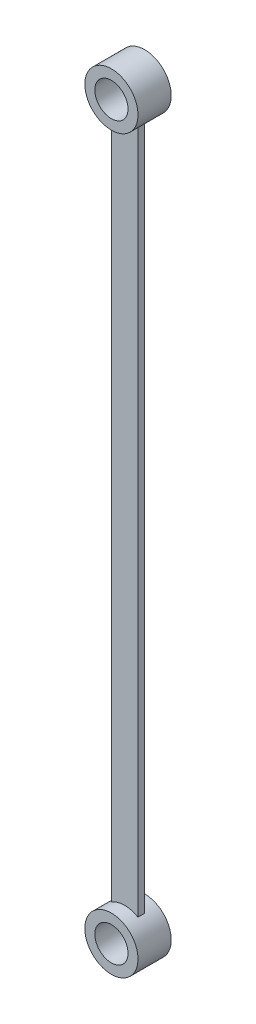
ISO-10303-21;
HEADER;
FILE_DESCRIPTION(('STEP AP214'),'2;1');
FILE_NAME('part.step','',(''),(''),'','','');
FILE_SCHEMA(('AUTOMOTIVE_DESIGN { 1 0 10303 214 1 1 1 1 }'));
ENDSEC;
DATA;
#1=APPLICATION_CONTEXT('core data for automotive mechanical design processes');
#2=APPLICATION_PROTOCOL_DEFINITION('international standard','automotive_design',2000,#1);
#3=PRODUCT_CONTEXT('',#1,'mechanical');
#4=PRODUCT('Part','Part','',(#3));
#5=PRODUCT_RELATED_PRODUCT_CATEGORY('part','',(#4));
#6=PRODUCT_DEFINITION_FORMATION('','',#4);
#7=PRODUCT_DEFINITION_CONTEXT('part definition',#1,'design');
#8=PRODUCT_DEFINITION('design','',#6,#7);
#9=PRODUCT_DEFINITION_SHAPE('','',#8);
#10=(LENGTH_UNIT() NAMED_UNIT(*) SI_UNIT(.MILLI.,.METRE.));
#11=(NAMED_UNIT(*) PLANE_ANGLE_UNIT() SI_UNIT($,.RADIAN.));
#12=(NAMED_UNIT(*) SI_UNIT($,.STERADIAN.) SOLID_ANGLE_UNIT());
#13=UNCERTAINTY_MEASURE_WITH_UNIT(LENGTH_MEASURE(1.E-05),#10,'distance_accuracy_value','');
#14=(GEOMETRIC_REPRESENTATION_CONTEXT(3) GLOBAL_UNCERTAINTY_ASSIGNED_CONTEXT((#13)) GLOBAL_UNIT_ASSIGNED_CONTEXT((#10,
#11,#12)) REPRESENTATION_CONTEXT('',''));
#15=CARTESIAN_POINT('',(0.,0.,0.));
#16=DIRECTION('',(0.,0.,1.));
#17=DIRECTION('',(1.,0.,0.));
#18=AXIS2_PLACEMENT_3D('',#15,#16,#17);
#19=CARTESIAN_POINT('',(0.,55.,-2.5));
#20=DIRECTION('',(0.,0.,1.));
#21=DIRECTION('',(1.,0.,0.));
#22=AXIS2_PLACEMENT_3D('',#19,#20,#21);
#23=PLANE('',#22);
#24=CARTESIAN_POINT('',(0.,0.,-2.5));
#25=DIRECTION('',(0.,0.,1.));
#26=DIRECTION('',(-1.,0.,0.));
#27=AXIS2_PLACEMENT_3D('',#24,#25,#26);
#28=CIRCLE('',#27,2.5);
#29=CARTESIAN_POINT('',(2.5,0.,-2.5));
#30=VERTEX_POINT('',#29);
#31=EDGE_CURVE('E26',#30,#30,#28,.T.);
#32=ORIENTED_EDGE('',*,*,#31,.T.);
#33=EDGE_LOOP('',(#32));
#34=FACE_BOUND('',#33,.T.);
#35=CARTESIAN_POINT('',(0.,0.,-2.5));
#36=DIRECTION('',(0.,0.,1.));
#37=DIRECTION('',(1.,0.,0.));
#38=AXIS2_PLACEMENT_3D('',#35,#36,#37);
#39=CIRCLE('',#38,4.);
#40=CARTESIAN_POINT('',(2.,3.46410161513775,-2.5));
#41=VERTEX_POINT('',#40);
#42=EDGE_CURVE('E10',#41,#41,#39,.T.);
#43=ORIENTED_EDGE('',*,*,#42,.F.);
#44=EDGE_LOOP('',(#43));
#45=FACE_BOUND('',#44,.T.);
#46=ADVANCED_FACE('F16',(#34,#45),#23,.F.);
#47=CARTESIAN_POINT('',(0.,110.,0.));
#48=DIRECTION('',(0.,0.,1.));
#49=DIRECTION('',(1.,0.,0.));
#50=AXIS2_PLACEMENT_3D('',#47,#48,#49);
#51=CYLINDRICAL_SURFACE('',#50,4.);
#52=CARTESIAN_POINT('',(0.,110.,2.5));
#53=DIRECTION('',(0.,0.,-1.));
#54=DIRECTION('',(1.,0.,0.));
#55=AXIS2_PLACEMENT_3D('',#52,#53,#54);
#56=CIRCLE('',#55,4.);
#57=CARTESIAN_POINT('',(2.,106.535898384862,2.5));
#58=VERTEX_POINT('',#57);
#59=EDGE_CURVE('E147',#58,#58,#56,.T.);
#60=ORIENTED_EDGE('',*,*,#59,.T.);
#61=EDGE_LOOP('',(#60));
#62=FACE_BOUND('',#61,.T.);
#63=CARTESIAN_POINT('',(0.,110.,-0.5));
#64=DIRECTION('',(0.,0.,1.));
#65=DIRECTION('',(-1.,0.,0.));
#66=AXIS2_PLACEMENT_3D('',#63,#64,#65);
#67=CIRCLE('',#66,4.);
#68=CARTESIAN_POINT('',(-2.,106.535898384862,-0.5));
#69=VERTEX_POINT('',#68);
#70=CARTESIAN_POINT('',(2.,106.535898384862,-0.5));
#71=VERTEX_POINT('',#70);
#72=EDGE_CURVE('E152',#69,#71,#67,.T.);
#73=ORIENTED_EDGE('',*,*,#72,.F.);
#74=DIRECTION('',(0.,0.,-1.));
#75=VECTOR('',#74,1.);
#76=CARTESIAN_POINT('',(-2.,106.535898384862,0.5));
#77=LINE('',#76,#75);
#78=CARTESIAN_POINT('',(-2.,106.535898384862,0.5));
#79=VERTEX_POINT('',#78);
#80=EDGE_CURVE('E158',#79,#69,#77,.T.);
#81=ORIENTED_EDGE('',*,*,#80,.F.);
#82=CARTESIAN_POINT('',(0.,110.,0.5));
#83=DIRECTION('',(0.,0.,1.));
#84=DIRECTION('',(-1.,0.,0.));
#85=AXIS2_PLACEMENT_3D('',#82,#83,#84);
#86=CIRCLE('',#85,4.);
#87=CARTESIAN_POINT('',(2.,106.535898384862,0.5));
#88=VERTEX_POINT('',#87);
#89=EDGE_CURVE('E168',#79,#88,#86,.T.);
#90=ORIENTED_EDGE('',*,*,#89,.T.);
#91=DIRECTION('',(0.,0.,1.));
#92=VECTOR('',#91,1.);
#93=CARTESIAN_POINT('',(2.,106.535898384862,-0.5));
#94=LINE('',#93,#92);
#95=EDGE_CURVE('E133',#71,#88,#94,.T.);
#96=ORIENTED_EDGE('',*,*,#95,.F.);
#97=EDGE_LOOP('',(#73,#81,#90,#96));
#98=FACE_BOUND('',#97,.T.);
#99=CARTESIAN_POINT('',(0.,110.,-2.5));
#100=DIRECTION('',(0.,0.,-1.));
#101=DIRECTION('',(-1.,0.,0.));
#102=AXIS2_PLACEMENT_3D('',#99,#100,#101);
#103=CIRCLE('',#102,4.);
#104=CARTESIAN_POINT('',(2.,106.535898384862,-2.5));
#105=VERTEX_POINT('',#104);
#106=EDGE_CURVE('E130',#105,#105,#103,.T.);
#107=ORIENTED_EDGE('',*,*,#106,.F.);
#108=EDGE_LOOP('',(#107));
#109=FACE_BOUND('',#108,.T.);
#110=ADVANCED_FACE('F287',(#62,#98,#109),#51,.T.);
#111=CARTESIAN_POINT('',(0.,0.,0.));
#112=DIRECTION('',(0.,0.,1.));
#113=DIRECTION('',(1.,0.,0.));
#114=AXIS2_PLACEMENT_3D('',#111,#112,#113);
#115=CYLINDRICAL_SURFACE('',#114,4.);
#116=ORIENTED_EDGE('',*,*,#42,.T.);
#117=EDGE_LOOP('',(#116));
#118=FACE_BOUND('',#117,.T.);
#119=DIRECTION('',(0.,0.,1.));
#120=VECTOR('',#119,1.);
#121=CARTESIAN_POINT('',(2.,3.46410161513775,-0.5));
#122=LINE('',#121,#120);
#123=CARTESIAN_POINT('',(2.,3.46410161513775,-0.5));
#124=VERTEX_POINT('',#123);
#125=CARTESIAN_POINT('',(2.,3.46410161513775,0.5));
#126=VERTEX_POINT('',#125);
#127=EDGE_CURVE('E121',#124,#126,#122,.T.);
#128=ORIENTED_EDGE('',*,*,#127,.T.);
#129=CARTESIAN_POINT('',(0.,0.,0.5));
#130=DIRECTION('',(0.,0.,1.));
#131=DIRECTION('',(-1.,0.,0.));
#132=AXIS2_PLACEMENT_3D('',#129,#130,#131);
#133=CIRCLE('',#132,4.);
#134=CARTESIAN_POINT('',(-2.,3.46410161513775,0.5));
#135=VERTEX_POINT('',#134);
#136=EDGE_CURVE('E107',#126,#135,#133,.T.);
#137=ORIENTED_EDGE('',*,*,#136,.T.);
#138=DIRECTION('',(0.,0.,1.));
#139=VECTOR('',#138,1.);
#140=CARTESIAN_POINT('',(-2.,3.46410161513775,-0.5));
#141=LINE('',#140,#139);
#142=CARTESIAN_POINT('',(-2.,3.46410161513775,-0.5));
#143=VERTEX_POINT('',#142);
#144=EDGE_CURVE('E118',#143,#135,#141,.T.);
#145=ORIENTED_EDGE('',*,*,#144,.F.);
#146=CARTESIAN_POINT('',(0.,0.,-0.5));
#147=DIRECTION('',(0.,0.,1.));
#148=DIRECTION('',(-1.,0.,0.));
#149=AXIS2_PLACEMENT_3D('',#146,#147,#148);
#150=CIRCLE('',#149,4.);
#151=EDGE_CURVE('E125',#124,#143,#150,.T.);
#152=ORIENTED_EDGE('',*,*,#151,.F.);
#153=EDGE_LOOP('',(#128,#137,#145,#152));
#154=FACE_BOUND('',#153,.T.);
#155=CARTESIAN_POINT('',(0.,0.,2.5));
#156=DIRECTION('',(0.,0.,1.));
#157=DIRECTION('',(-1.,0.,0.));
#158=AXIS2_PLACEMENT_3D('',#155,#156,#157);
#159=CIRCLE('',#158,4.);
#160=CARTESIAN_POINT('',(2.,3.46410161513775,2.5));
#161=VERTEX_POINT('',#160);
#162=EDGE_CURVE('E80',#161,#161,#159,.T.);
#163=ORIENTED_EDGE('',*,*,#162,.F.);
#164=EDGE_LOOP('',(#163));
#165=FACE_BOUND('',#164,.T.);
#166=ADVANCED_FACE('F122',(#118,#154,#165),#115,.T.);
#167=CARTESIAN_POINT('',(0.,110.,0.));
#168=DIRECTION('',(0.,0.,1.));
#169=DIRECTION('',(-1.,0.,0.));
#170=AXIS2_PLACEMENT_3D('',#167,#168,#169);
#171=CYLINDRICAL_SURFACE('',#170,2.5);
#172=CARTESIAN_POINT('',(0.,110.,2.5));
#173=DIRECTION('',(0.,0.,-1.));
#174=DIRECTION('',(-1.,0.,0.));
#175=AXIS2_PLACEMENT_3D('',#172,#173,#174);
#176=CIRCLE('',#175,2.5);
#177=CARTESIAN_POINT('',(2.5,110.,2.5));
#178=VERTEX_POINT('',#177);
#179=EDGE_CURVE('E86',#178,#178,#176,.T.);
#180=ORIENTED_EDGE('',*,*,#179,.F.);
#181=EDGE_LOOP('',(#180));
#182=FACE_BOUND('',#181,.T.);
#183=CARTESIAN_POINT('',(0.,110.,-2.5));
#184=DIRECTION('',(0.,0.,1.));
#185=DIRECTION('',(-1.,0.,0.));
#186=AXIS2_PLACEMENT_3D('',#183,#184,#185);
#187=CIRCLE('',#186,2.5);
#188=CARTESIAN_POINT('',(2.5,110.,-2.5));
#189=VERTEX_POINT('',#188);
#190=EDGE_CURVE('E166',#189,#189,#187,.T.);
#191=ORIENTED_EDGE('',*,*,#190,.F.);
#192=EDGE_LOOP('',(#191));
#193=FACE_BOUND('',#192,.T.);
#194=ADVANCED_FACE('F243',(#182,#193),#171,.F.);
#195=CARTESIAN_POINT('',(0.,0.,0.));
#196=DIRECTION('',(0.,0.,1.));
#197=DIRECTION('',(-1.,0.,0.));
#198=AXIS2_PLACEMENT_3D('',#195,#196,#197);
#199=CYLINDRICAL_SURFACE('',#198,2.5);
#200=CARTESIAN_POINT('',(0.,0.,2.5));
#201=DIRECTION('',(0.,0.,-1.));
#202=DIRECTION('',(-1.,0.,0.));
#203=AXIS2_PLACEMENT_3D('',#200,#201,#202);
#204=CIRCLE('',#203,2.5);
#205=CARTESIAN_POINT('',(2.5,0.,2.5));
#206=VERTEX_POINT('',#205);
#207=EDGE_CURVE('E19',#206,#206,#204,.T.);
#208=ORIENTED_EDGE('',*,*,#207,.F.);
#209=EDGE_LOOP('',(#208));
#210=FACE_BOUND('',#209,.T.);
#211=ORIENTED_EDGE('',*,*,#31,.F.);
#212=EDGE_LOOP('',(#211));
#213=FACE_BOUND('',#212,.T.);
#214=ADVANCED_FACE('F248',(#210,#213),#199,.F.);
#215=CARTESIAN_POINT('',(0.,55.,2.5));
#216=DIRECTION('',(0.,0.,1.));
#217=DIRECTION('',(1.,0.,0.));
#218=AXIS2_PLACEMENT_3D('',#215,#216,#217);
#219=PLANE('',#218);
#220=ORIENTED_EDGE('',*,*,#207,.T.);
#221=EDGE_LOOP('',(#220));
#222=FACE_BOUND('',#221,.T.);
#223=ORIENTED_EDGE('',*,*,#162,.T.);
#224=EDGE_LOOP('',(#223));
#225=FACE_BOUND('',#224,.T.);
#226=ADVANCED_FACE('F260',(#222,#225),#219,.T.);
#227=CARTESIAN_POINT('',(0.,55.,2.5));
#228=DIRECTION('',(0.,0.,1.));
#229=DIRECTION('',(1.,0.,0.));
#230=AXIS2_PLACEMENT_3D('',#227,#228,#229);
#231=PLANE('',#230);
#232=ORIENTED_EDGE('',*,*,#179,.T.);
#233=EDGE_LOOP('',(#232));
#234=FACE_BOUND('',#233,.T.);
#235=ORIENTED_EDGE('',*,*,#59,.F.);
#236=EDGE_LOOP('',(#235));
#237=FACE_BOUND('',#236,.T.);
#238=ADVANCED_FACE('F236',(#234,#237),#231,.T.);
#239=CARTESIAN_POINT('',(-2.,3.46410161513775,0.));
#240=DIRECTION('',(-1.,0.,0.));
#241=DIRECTION('',(0.,0.,1.));
#242=AXIS2_PLACEMENT_3D('',#239,#240,#241);
#243=PLANE('',#242);
#244=DIRECTION('',(0.,-1.,0.));
#245=VECTOR('',#244,1.);
#246=CARTESIAN_POINT('',(-2.,106.535898384862,-0.5));
#247=LINE('',#246,#245);
#248=EDGE_CURVE('E140',#69,#143,#247,.T.);
#249=ORIENTED_EDGE('',*,*,#248,.T.);
#250=ORIENTED_EDGE('',*,*,#144,.T.);
#251=DIRECTION('',(0.,1.,0.));
#252=VECTOR('',#251,1.);
#253=CARTESIAN_POINT('',(-2.,3.46410161513775,0.5));
#254=LINE('',#253,#252);
#255=EDGE_CURVE('E115',#135,#79,#254,.T.);
#256=ORIENTED_EDGE('',*,*,#255,.T.);
#257=ORIENTED_EDGE('',*,*,#80,.T.);
#258=EDGE_LOOP('',(#249,#250,#256,#257));
#259=FACE_BOUND('',#258,.T.);
#260=ADVANCED_FACE('F184',(#259),#243,.T.);
#261=CARTESIAN_POINT('',(0.,55.,0.5));
#262=DIRECTION('',(0.,0.,1.));
#263=DIRECTION('',(1.,0.,0.));
#264=AXIS2_PLACEMENT_3D('',#261,#262,#263);
#265=PLANE('',#264);
#266=ORIENTED_EDGE('',*,*,#89,.F.);
#267=ORIENTED_EDGE('',*,*,#255,.F.);
#268=ORIENTED_EDGE('',*,*,#136,.F.);
#269=DIRECTION('',(0.,-1.,0.));
#270=VECTOR('',#269,1.);
#271=CARTESIAN_POINT('',(2.,106.535898384862,0.5));
#272=LINE('',#271,#270);
#273=EDGE_CURVE('E112',#88,#126,#272,.T.);
#274=ORIENTED_EDGE('',*,*,#273,.F.);
#275=EDGE_LOOP('',(#266,#267,#268,#274));
#276=FACE_BOUND('',#275,.T.);
#277=ADVANCED_FACE('F110',(#276),#265,.T.);
#278=CARTESIAN_POINT('',(0.,55.,-2.5));
#279=DIRECTION('',(0.,0.,1.));
#280=DIRECTION('',(1.,0.,0.));
#281=AXIS2_PLACEMENT_3D('',#278,#279,#280);
#282=PLANE('',#281);
#283=ORIENTED_EDGE('',*,*,#190,.T.);
#284=EDGE_LOOP('',(#283));
#285=FACE_BOUND('',#284,.T.);
#286=ORIENTED_EDGE('',*,*,#106,.T.);
#287=EDGE_LOOP('',(#286));
#288=FACE_BOUND('',#287,.T.);
#289=ADVANCED_FACE('F224',(#285,#288),#282,.F.);
#290=CARTESIAN_POINT('',(2.,106.535898384862,0.));
#291=DIRECTION('',(1.,0.,0.));
#292=DIRECTION('',(0.,1.,0.));
#293=AXIS2_PLACEMENT_3D('',#290,#291,#292);
#294=PLANE('',#293);
#295=DIRECTION('',(0.,1.,0.));
#296=VECTOR('',#295,1.);
#297=CARTESIAN_POINT('',(2.,3.46410161513775,-0.5));
#298=LINE('',#297,#296);
#299=EDGE_CURVE('E149',#124,#71,#298,.T.);
#300=ORIENTED_EDGE('',*,*,#299,.T.);
#301=ORIENTED_EDGE('',*,*,#95,.T.);
#302=ORIENTED_EDGE('',*,*,#273,.T.);
#303=ORIENTED_EDGE('',*,*,#127,.F.);
#304=EDGE_LOOP('',(#300,#301,#302,#303));
#305=FACE_BOUND('',#304,.T.);
#306=ADVANCED_FACE('F132',(#305),#294,.T.);
#307=CARTESIAN_POINT('',(-2.,106.535898384862,-0.5));
#308=CARTESIAN_POINT('',(-2.,3.46410161513775,-0.5));
#309=CARTESIAN_POINT('',(2.,106.535898384862,-0.5));
#310=CARTESIAN_POINT('',(2.,3.46410161513775,-0.5));
#311=(BOUNDED_SURFACE() B_SPLINE_SURFACE(1,1,((#307,#308),(#309,#310)),.UNSPECIFIED.,.F.,.F.,
.F.) B_SPLINE_SURFACE_WITH_KNOTS((2,2),(2,2),(0.,4.),(0.,103.071796769724),
.UNSPECIFIED.) GEOMETRIC_REPRESENTATION_ITEM() RATIONAL_B_SPLINE_SURFACE(((1.,1.),(1.,1.))) REPRESENTATION_ITEM('') SURFACE());
#312=ORIENTED_EDGE('',*,*,#72,.T.);
#313=ORIENTED_EDGE('',*,*,#299,.F.);
#314=ORIENTED_EDGE('',*,*,#151,.T.);
#315=ORIENTED_EDGE('',*,*,#248,.F.);
#316=EDGE_LOOP('',(#312,#313,#314,#315));
#317=FACE_BOUND('',#316,.T.);
#318=ADVANCED_FACE('F188',(#317),#311,.T.);
#319=CLOSED_SHELL('',(#46,#110,#166,#194,#214,#226,#238,#260,#277,#289,#306,#318));
#320=MANIFOLD_SOLID_BREP('B1',#319);
#321=ADVANCED_BREP_SHAPE_REPRESENTATION('',(#18,#320),#14);
#322=SHAPE_DEFINITION_REPRESENTATION(#9,#321);
ENDSEC;
END-ISO-10303-21;
